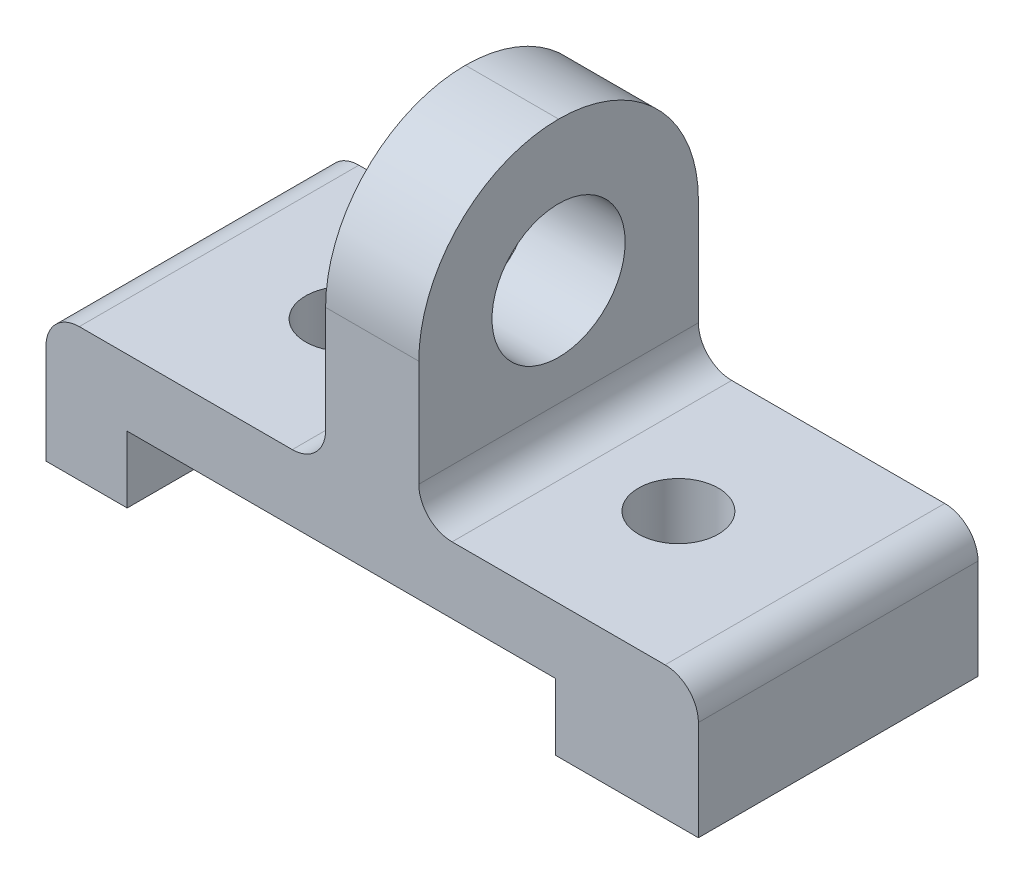
ISO-10303-21;
HEADER;
FILE_DESCRIPTION(('STEP AP214'),'2;1');
FILE_NAME('part.step','',(''),(''),'','','');
FILE_SCHEMA(('AUTOMOTIVE_DESIGN { 1 0 10303 214 1 1 1 1 }'));
ENDSEC;
DATA;
#1=APPLICATION_CONTEXT('core data for automotive mechanical design processes');
#2=APPLICATION_PROTOCOL_DEFINITION('international standard','automotive_design',2000,#1);
#3=PRODUCT_CONTEXT('',#1,'mechanical');
#4=PRODUCT('Part','Part','',(#3));
#5=PRODUCT_RELATED_PRODUCT_CATEGORY('part','',(#4));
#6=PRODUCT_DEFINITION_FORMATION('','',#4);
#7=PRODUCT_DEFINITION_CONTEXT('part definition',#1,'design');
#8=PRODUCT_DEFINITION('design','',#6,#7);
#9=PRODUCT_DEFINITION_SHAPE('','',#8);
#10=(LENGTH_UNIT() NAMED_UNIT(*) SI_UNIT(.MILLI.,.METRE.));
#11=(NAMED_UNIT(*) PLANE_ANGLE_UNIT() SI_UNIT($,.RADIAN.));
#12=(NAMED_UNIT(*) SI_UNIT($,.STERADIAN.) SOLID_ANGLE_UNIT());
#13=UNCERTAINTY_MEASURE_WITH_UNIT(LENGTH_MEASURE(1.E-05),#10,'distance_accuracy_value','');
#14=(GEOMETRIC_REPRESENTATION_CONTEXT(3) GLOBAL_UNCERTAINTY_ASSIGNED_CONTEXT((#13)) GLOBAL_UNIT_ASSIGNED_CONTEXT((#10,
#11,#12)) REPRESENTATION_CONTEXT('',''));
#15=CARTESIAN_POINT('',(0.,0.,0.));
#16=DIRECTION('',(0.,0.,1.));
#17=DIRECTION('',(1.,0.,0.));
#18=AXIS2_PLACEMENT_3D('',#15,#16,#17);
#19=CARTESIAN_POINT('',(76.5282170693056,-10.,-42.));
#20=DIRECTION('',(1.,0.,0.));
#21=DIRECTION('',(0.,0.,-1.));
#22=AXIS2_PLACEMENT_3D('',#19,#20,#21);
#23=PLANE('',#22);
#24=DIRECTION('',(0.,1.,0.));
#25=VECTOR('',#24,1.);
#26=CARTESIAN_POINT('',(76.5282170693056,-10.,-26.4413342527795));
#27=LINE('',#26,#25);
#28=CARTESIAN_POINT('',(76.5282170693056,0.,-26.4413342527795));
#29=VERTEX_POINT('',#28);
#30=CARTESIAN_POINT('',(76.5282170693056,-10.,-26.4413342527795));
#31=VERTEX_POINT('',#30);
#32=EDGE_CURVE('E162',#29,#31,#27,.F.);
#33=ORIENTED_EDGE('',*,*,#32,.F.);
#34=DIRECTION('',(0.,0.,1.));
#35=VECTOR('',#34,1.);
#36=CARTESIAN_POINT('',(76.5282170693056,0.,-42.));
#37=LINE('',#36,#35);
#38=CARTESIAN_POINT('',(76.5282170693056,0.,-42.));
#39=VERTEX_POINT('',#38);
#40=EDGE_CURVE('E191',#39,#29,#37,.T.);
#41=ORIENTED_EDGE('',*,*,#40,.F.);
#42=DIRECTION('',(0.,1.,0.));
#43=VECTOR('',#42,1.);
#44=CARTESIAN_POINT('',(76.5282170693056,-10.,-42.));
#45=LINE('',#44,#43);
#46=CARTESIAN_POINT('',(76.5282170693056,-10.,-42.));
#47=VERTEX_POINT('',#46);
#48=EDGE_CURVE('E188',#47,#39,#45,.T.);
#49=ORIENTED_EDGE('',*,*,#48,.F.);
#50=DIRECTION('',(0.,0.,1.));
#51=VECTOR('',#50,1.);
#52=CARTESIAN_POINT('',(76.5282170693056,-10.,-42.));
#53=LINE('',#52,#51);
#54=EDGE_CURVE('E181',#47,#31,#53,.T.);
#55=ORIENTED_EDGE('',*,*,#54,.T.);
#56=EDGE_LOOP('',(#33,#41,#49,#55));
#57=FACE_BOUND('',#56,.T.);
#58=ADVANCED_FACE('F33',(#57),#23,.F.);
#59=DIRECTION('',(0.,1.,0.));
#60=VECTOR('',#59,1.);
#61=CARTESIAN_POINT('',(76.5282170693056,-10.,-15.5586657472205));
#62=LINE('',#61,#60);
#63=CARTESIAN_POINT('',(76.5282170693056,-10.,-15.5586657472205));
#64=VERTEX_POINT('',#63);
#65=CARTESIAN_POINT('',(76.5282170693056,0.,-15.5586657472205));
#66=VERTEX_POINT('',#65);
#67=EDGE_CURVE('E174',#64,#66,#62,.T.);
#68=ORIENTED_EDGE('',*,*,#67,.F.);
#69=CARTESIAN_POINT('',(76.5282170693056,-10.,0.));
#70=VERTEX_POINT('',#69);
#71=EDGE_CURVE('E184',#64,#70,#53,.T.);
#72=ORIENTED_EDGE('',*,*,#71,.T.);
#73=DIRECTION('',(0.,1.,0.));
#74=VECTOR('',#73,1.);
#75=CARTESIAN_POINT('',(76.5282170693056,-10.,0.));
#76=LINE('',#75,#74);
#77=CARTESIAN_POINT('',(76.5282170693056,0.,0.));
#78=VERTEX_POINT('',#77);
#79=EDGE_CURVE('E317',#70,#78,#76,.T.);
#80=ORIENTED_EDGE('',*,*,#79,.T.);
#81=EDGE_CURVE('E189',#66,#78,#37,.T.);
#82=ORIENTED_EDGE('',*,*,#81,.F.);
#83=EDGE_LOOP('',(#68,#72,#80,#82));
#84=FACE_BOUND('',#83,.T.);
#85=ADVANCED_FACE('F345',(#84),#23,.F.);
#86=CARTESIAN_POINT('',(0.,10.,0.));
#87=DIRECTION('',(0.,-1.,0.));
#88=DIRECTION('',(0.,0.,-1.));
#89=AXIS2_PLACEMENT_3D('',#86,#87,#88);
#90=PLANE('',#89);
#91=CARTESIAN_POINT('',(74.,10.,-21.));
#92=DIRECTION('',(0.,-1.,0.));
#93=DIRECTION('',(0.,0.,1.));
#94=AXIS2_PLACEMENT_3D('',#91,#92,#93);
#95=CIRCLE('',#94,6.);
#96=CARTESIAN_POINT('',(74.,10.,-15.));
#97=VERTEX_POINT('',#96);
#98=EDGE_CURVE('E185',#97,#97,#95,.T.);
#99=ORIENTED_EDGE('',*,*,#98,.T.);
#100=EDGE_LOOP('',(#99));
#101=FACE_BOUND('',#100,.T.);
#102=DIRECTION('',(-1.,0.,0.));
#103=VECTOR('',#102,1.);
#104=CARTESIAN_POINT('',(0.,10.,-42.));
#105=LINE('',#104,#103);
#106=CARTESIAN_POINT('',(93.,10.,-42.));
#107=VERTEX_POINT('',#106);
#108=CARTESIAN_POINT('',(61.,10.,-42.));
#109=VERTEX_POINT('',#108);
#110=EDGE_CURVE('E201',#107,#109,#105,.T.);
#111=ORIENTED_EDGE('',*,*,#110,.T.);
#112=DIRECTION('',(0.,0.,-1.));
#113=VECTOR('',#112,1.);
#114=CARTESIAN_POINT('',(61.,10.,0.));
#115=LINE('',#114,#113);
#116=CARTESIAN_POINT('',(61.,10.,0.));
#117=VERTEX_POINT('',#116);
#118=EDGE_CURVE('E54',#109,#117,#115,.F.);
#119=ORIENTED_EDGE('',*,*,#118,.T.);
#120=DIRECTION('',(1.,0.,0.));
#121=VECTOR('',#120,1.);
#122=CARTESIAN_POINT('',(0.,10.,0.));
#123=LINE('',#122,#121);
#124=CARTESIAN_POINT('',(93.,10.,0.));
#125=VERTEX_POINT('',#124);
#126=EDGE_CURVE('E200',#117,#125,#123,.T.);
#127=ORIENTED_EDGE('',*,*,#126,.T.);
#128=DIRECTION('',(0.,0.,-1.));
#129=VECTOR('',#128,1.);
#130=CARTESIAN_POINT('',(93.,10.,0.));
#131=LINE('',#130,#129);
#132=EDGE_CURVE('E173',#125,#107,#131,.T.);
#133=ORIENTED_EDGE('',*,*,#132,.T.);
#134=EDGE_LOOP('',(#111,#119,#127,#133));
#135=FACE_BOUND('',#134,.T.);
#136=ADVANCED_FACE('F375',(#101,#135),#90,.F.);
#137=CARTESIAN_POINT('',(0.,10.,0.));
#138=DIRECTION('',(0.,0.,-1.));
#139=DIRECTION('',(-1.,0.,0.));
#140=AXIS2_PLACEMENT_3D('',#137,#138,#139);
#141=PLANE('',#140);
#142=CARTESIAN_POINT('',(5.,10.,0.));
#143=VERTEX_POINT('',#142);
#144=CARTESIAN_POINT('',(37.,10.,0.));
#145=VERTEX_POINT('',#144);
#146=EDGE_CURVE('E196',#143,#145,#123,.T.);
#147=ORIENTED_EDGE('',*,*,#146,.F.);
#148=CARTESIAN_POINT('',(5.,5.,0.));
#149=DIRECTION('',(0.,0.,-1.));
#150=DIRECTION('',(-1.,0.,0.));
#151=AXIS2_PLACEMENT_3D('',#148,#149,#150);
#152=CIRCLE('',#151,5.);
#153=CARTESIAN_POINT('',(0.,5.,0.));
#154=VERTEX_POINT('',#153);
#155=EDGE_CURVE('E263',#143,#154,#152,.F.);
#156=ORIENTED_EDGE('',*,*,#155,.T.);
#157=DIRECTION('',(0.,-1.,0.));
#158=VECTOR('',#157,1.);
#159=CARTESIAN_POINT('',(0.,10.,0.));
#160=LINE('',#159,#158);
#161=CARTESIAN_POINT('',(0.,-10.,0.));
#162=VERTEX_POINT('',#161);
#163=EDGE_CURVE('E223',#154,#162,#160,.T.);
#164=ORIENTED_EDGE('',*,*,#163,.T.);
#165=DIRECTION('',(1.,0.,0.));
#166=VECTOR('',#165,1.);
#167=CARTESIAN_POINT('',(0.,-10.,0.));
#168=LINE('',#167,#166);
#169=CARTESIAN_POINT('',(12.1991203389282,-10.,0.));
#170=VERTEX_POINT('',#169);
#171=EDGE_CURVE('E209',#162,#170,#168,.T.);
#172=ORIENTED_EDGE('',*,*,#171,.T.);
#173=DIRECTION('',(0.,1.,0.));
#174=VECTOR('',#173,1.);
#175=CARTESIAN_POINT('',(12.1991203389282,-10.,0.));
#176=LINE('',#175,#174);
#177=CARTESIAN_POINT('',(12.1991203389282,0.,0.));
#178=VERTEX_POINT('',#177);
#179=EDGE_CURVE('E314',#170,#178,#176,.T.);
#180=ORIENTED_EDGE('',*,*,#179,.T.);
#181=DIRECTION('',(1.,0.,0.));
#182=VECTOR('',#181,1.);
#183=CARTESIAN_POINT('',(12.1991203389282,0.,0.));
#184=LINE('',#183,#182);
#185=EDGE_CURVE('E320',#178,#78,#184,.T.);
#186=ORIENTED_EDGE('',*,*,#185,.T.);
#187=ORIENTED_EDGE('',*,*,#79,.F.);
#188=CARTESIAN_POINT('',(98.,-10.,0.));
#189=VERTEX_POINT('',#188);
#190=EDGE_CURVE('E207',#70,#189,#168,.T.);
#191=ORIENTED_EDGE('',*,*,#190,.T.);
#192=DIRECTION('',(0.,-1.,0.));
#193=VECTOR('',#192,1.);
#194=CARTESIAN_POINT('',(98.,10.,0.));
#195=LINE('',#194,#193);
#196=CARTESIAN_POINT('',(98.,5.,0.));
#197=VERTEX_POINT('',#196);
#198=EDGE_CURVE('E221',#197,#189,#195,.T.);
#199=ORIENTED_EDGE('',*,*,#198,.F.);
#200=CARTESIAN_POINT('',(93.,5.,0.));
#201=DIRECTION('',(0.,0.,-1.));
#202=DIRECTION('',(-1.,0.,0.));
#203=AXIS2_PLACEMENT_3D('',#200,#201,#202);
#204=CIRCLE('',#203,5.);
#205=EDGE_CURVE('E257',#197,#125,#204,.F.);
#206=ORIENTED_EDGE('',*,*,#205,.T.);
#207=ORIENTED_EDGE('',*,*,#126,.F.);
#208=CARTESIAN_POINT('',(61.,15.,0.));
#209=DIRECTION('',(0.,0.,-1.));
#210=DIRECTION('',(-1.,0.,0.));
#211=AXIS2_PLACEMENT_3D('',#208,#209,#210);
#212=CIRCLE('',#211,5.);
#213=CARTESIAN_POINT('',(56.,15.,0.));
#214=VERTEX_POINT('',#213);
#215=EDGE_CURVE('E11',#117,#214,#212,.T.);
#216=ORIENTED_EDGE('',*,*,#215,.T.);
#217=DIRECTION('',(0.,-1.,0.));
#218=VECTOR('',#217,1.);
#219=CARTESIAN_POINT('',(56.,10.,0.));
#220=LINE('',#219,#218);
#221=CARTESIAN_POINT('',(56.,31.,0.));
#222=VERTEX_POINT('',#221);
#223=EDGE_CURVE('E304',#222,#214,#220,.T.);
#224=ORIENTED_EDGE('',*,*,#223,.F.);
#225=DIRECTION('',(-1.,0.,0.));
#226=VECTOR('',#225,1.);
#227=CARTESIAN_POINT('',(0.,31.,0.));
#228=LINE('',#227,#226);
#229=CARTESIAN_POINT('',(42.,31.,0.));
#230=VERTEX_POINT('',#229);
#231=EDGE_CURVE('E225',#222,#230,#228,.T.);
#232=ORIENTED_EDGE('',*,*,#231,.T.);
#233=DIRECTION('',(0.,-1.,0.));
#234=VECTOR('',#233,1.);
#235=CARTESIAN_POINT('',(42.,10.,0.));
#236=LINE('',#235,#234);
#237=CARTESIAN_POINT('',(42.,15.,0.));
#238=VERTEX_POINT('',#237);
#239=EDGE_CURVE('E243',#230,#238,#236,.T.);
#240=ORIENTED_EDGE('',*,*,#239,.T.);
#241=CARTESIAN_POINT('',(37.,15.,0.));
#242=DIRECTION('',(0.,0.,-1.));
#243=DIRECTION('',(-1.,0.,0.));
#244=AXIS2_PLACEMENT_3D('',#241,#242,#243);
#245=CIRCLE('',#244,5.);
#246=EDGE_CURVE('E281',#238,#145,#245,.T.);
#247=ORIENTED_EDGE('',*,*,#246,.T.);
#248=EDGE_LOOP('',(#147,#156,#164,#172,#180,#186,#187,#191,#199,#206,#207,#216,#224,#232,#240,#247));
#249=FACE_BOUND('',#248,.T.);
#250=ADVANCED_FACE('F286',(#249),#141,.F.);
#251=CARTESIAN_POINT('',(0.,10.,-42.));
#252=DIRECTION('',(0.,0.,1.));
#253=DIRECTION('',(1.,0.,0.));
#254=AXIS2_PLACEMENT_3D('',#251,#252,#253);
#255=PLANE('',#254);
#256=DIRECTION('',(0.,-1.,0.));
#257=VECTOR('',#256,1.);
#258=CARTESIAN_POINT('',(0.,10.,-42.));
#259=LINE('',#258,#257);
#260=CARTESIAN_POINT('',(0.,5.,-42.));
#261=VERTEX_POINT('',#260);
#262=CARTESIAN_POINT('',(0.,-10.,-42.));
#263=VERTEX_POINT('',#262);
#264=EDGE_CURVE('E203',#261,#263,#259,.T.);
#265=ORIENTED_EDGE('',*,*,#264,.F.);
#266=CARTESIAN_POINT('',(5.,5.,-42.));
#267=DIRECTION('',(0.,0.,1.));
#268=DIRECTION('',(1.,0.,0.));
#269=AXIS2_PLACEMENT_3D('',#266,#267,#268);
#270=CIRCLE('',#269,5.);
#271=CARTESIAN_POINT('',(5.,10.,-42.));
#272=VERTEX_POINT('',#271);
#273=EDGE_CURVE('E267',#261,#272,#270,.F.);
#274=ORIENTED_EDGE('',*,*,#273,.T.);
#275=CARTESIAN_POINT('',(37.,10.,-42.));
#276=VERTEX_POINT('',#275);
#277=EDGE_CURVE('E199',#276,#272,#105,.T.);
#278=ORIENTED_EDGE('',*,*,#277,.F.);
#279=CARTESIAN_POINT('',(37.,15.,-42.));
#280=DIRECTION('',(0.,0.,1.));
#281=DIRECTION('',(1.,0.,0.));
#282=AXIS2_PLACEMENT_3D('',#279,#280,#281);
#283=CIRCLE('',#282,5.);
#284=CARTESIAN_POINT('',(42.,15.,-42.));
#285=VERTEX_POINT('',#284);
#286=EDGE_CURVE('E279',#276,#285,#283,.T.);
#287=ORIENTED_EDGE('',*,*,#286,.T.);
#288=DIRECTION('',(0.,1.,0.));
#289=VECTOR('',#288,1.);
#290=CARTESIAN_POINT('',(42.,10.,-42.));
#291=LINE('',#290,#289);
#292=CARTESIAN_POINT('',(42.,31.,-42.));
#293=VERTEX_POINT('',#292);
#294=EDGE_CURVE('E299',#285,#293,#291,.T.);
#295=ORIENTED_EDGE('',*,*,#294,.T.);
#296=DIRECTION('',(-1.,0.,0.));
#297=VECTOR('',#296,1.);
#298=CARTESIAN_POINT('',(0.,31.,-42.));
#299=LINE('',#298,#297);
#300=CARTESIAN_POINT('',(56.,31.,-42.));
#301=VERTEX_POINT('',#300);
#302=EDGE_CURVE('E237',#293,#301,#299,.F.);
#303=ORIENTED_EDGE('',*,*,#302,.T.);
#304=DIRECTION('',(0.,1.,0.));
#305=VECTOR('',#304,1.);
#306=CARTESIAN_POINT('',(56.,10.,-42.));
#307=LINE('',#306,#305);
#308=CARTESIAN_POINT('',(56.,15.,-42.));
#309=VERTEX_POINT('',#308);
#310=EDGE_CURVE('E307',#309,#301,#307,.T.);
#311=ORIENTED_EDGE('',*,*,#310,.F.);
#312=CARTESIAN_POINT('',(61.,15.,-42.));
#313=DIRECTION('',(0.,0.,1.));
#314=DIRECTION('',(1.,0.,0.));
#315=AXIS2_PLACEMENT_3D('',#312,#313,#314);
#316=CIRCLE('',#315,5.);
#317=EDGE_CURVE('E41',#309,#109,#316,.T.);
#318=ORIENTED_EDGE('',*,*,#317,.T.);
#319=ORIENTED_EDGE('',*,*,#110,.F.);
#320=CARTESIAN_POINT('',(93.,5.,-42.));
#321=DIRECTION('',(0.,0.,1.));
#322=DIRECTION('',(1.,0.,0.));
#323=AXIS2_PLACEMENT_3D('',#320,#321,#322);
#324=CIRCLE('',#323,5.);
#325=CARTESIAN_POINT('',(98.,5.,-42.));
#326=VERTEX_POINT('',#325);
#327=EDGE_CURVE('E253',#107,#326,#324,.F.);
#328=ORIENTED_EDGE('',*,*,#327,.T.);
#329=DIRECTION('',(0.,-1.,0.));
#330=VECTOR('',#329,1.);
#331=CARTESIAN_POINT('',(98.,10.,-42.));
#332=LINE('',#331,#330);
#333=CARTESIAN_POINT('',(98.,-10.,-42.));
#334=VERTEX_POINT('',#333);
#335=EDGE_CURVE('E219',#326,#334,#332,.T.);
#336=ORIENTED_EDGE('',*,*,#335,.T.);
#337=DIRECTION('',(-1.,0.,0.));
#338=VECTOR('',#337,1.);
#339=CARTESIAN_POINT('',(0.,-10.,-42.));
#340=LINE('',#339,#338);
#341=EDGE_CURVE('E216',#334,#47,#340,.T.);
#342=ORIENTED_EDGE('',*,*,#341,.T.);
#343=ORIENTED_EDGE('',*,*,#48,.T.);
#344=DIRECTION('',(1.,0.,0.));
#345=VECTOR('',#344,1.);
#346=CARTESIAN_POINT('',(12.1991203389282,0.,-42.));
#347=LINE('',#346,#345);
#348=CARTESIAN_POINT('',(12.1991203389282,0.,-42.));
#349=VERTEX_POINT('',#348);
#350=EDGE_CURVE('E313',#349,#39,#347,.T.);
#351=ORIENTED_EDGE('',*,*,#350,.F.);
#352=DIRECTION('',(0.,1.,0.));
#353=VECTOR('',#352,1.);
#354=CARTESIAN_POINT('',(12.1991203389282,-10.,-42.));
#355=LINE('',#354,#353);
#356=CARTESIAN_POINT('',(12.1991203389282,-10.,-42.));
#357=VERTEX_POINT('',#356);
#358=EDGE_CURVE('E193',#357,#349,#355,.T.);
#359=ORIENTED_EDGE('',*,*,#358,.F.);
#360=EDGE_CURVE('E215',#357,#263,#340,.T.);
#361=ORIENTED_EDGE('',*,*,#360,.T.);
#362=EDGE_LOOP('',(#265,#274,#278,#287,#295,#303,#311,#318,#319,#328,#336,#342,#343,#351,#359,#361));
#363=FACE_BOUND('',#362,.T.);
#364=ADVANCED_FACE('F298',(#363),#255,.F.);
#365=CARTESIAN_POINT('',(0.,-10.,0.));
#366=DIRECTION('',(0.,-1.,0.));
#367=DIRECTION('',(0.,0.,-1.));
#368=AXIS2_PLACEMENT_3D('',#365,#366,#367);
#369=PLANE('',#368);
#370=ORIENTED_EDGE('',*,*,#360,.F.);
#371=DIRECTION('',(0.,0.,1.));
#372=VECTOR('',#371,1.);
#373=CARTESIAN_POINT('',(12.1991203389282,-10.,-42.));
#374=LINE('',#373,#372);
#375=EDGE_CURVE('E208',#357,#170,#374,.T.);
#376=ORIENTED_EDGE('',*,*,#375,.T.);
#377=ORIENTED_EDGE('',*,*,#171,.F.);
#378=DIRECTION('',(0.,0.,1.));
#379=VECTOR('',#378,1.);
#380=CARTESIAN_POINT('',(0.,-10.,0.));
#381=LINE('',#380,#379);
#382=EDGE_CURVE('E204',#263,#162,#381,.T.);
#383=ORIENTED_EDGE('',*,*,#382,.F.);
#384=EDGE_LOOP('',(#370,#376,#377,#383));
#385=FACE_BOUND('',#384,.T.);
#386=ADVANCED_FACE('F350',(#385),#369,.T.);
#387=CARTESIAN_POINT('',(0.,10.,0.));
#388=DIRECTION('',(1.,0.,0.));
#389=DIRECTION('',(0.,0.,-1.));
#390=AXIS2_PLACEMENT_3D('',#387,#388,#389);
#391=PLANE('',#390);
#392=ORIENTED_EDGE('',*,*,#163,.F.);
#393=DIRECTION('',(0.,0.,1.));
#394=VECTOR('',#393,1.);
#395=CARTESIAN_POINT('',(0.,5.,0.));
#396=LINE('',#395,#394);
#397=EDGE_CURVE('E265',#154,#261,#396,.F.);
#398=ORIENTED_EDGE('',*,*,#397,.T.);
#399=ORIENTED_EDGE('',*,*,#264,.T.);
#400=ORIENTED_EDGE('',*,*,#382,.T.);
#401=EDGE_LOOP('',(#392,#398,#399,#400));
#402=FACE_BOUND('',#401,.T.);
#403=ADVANCED_FACE('F359',(#402),#391,.F.);
#404=CARTESIAN_POINT('',(98.,10.,0.));
#405=DIRECTION('',(-1.,0.,0.));
#406=DIRECTION('',(0.,0.,1.));
#407=AXIS2_PLACEMENT_3D('',#404,#405,#406);
#408=PLANE('',#407);
#409=ORIENTED_EDGE('',*,*,#335,.F.);
#410=DIRECTION('',(0.,0.,-1.));
#411=VECTOR('',#410,1.);
#412=CARTESIAN_POINT('',(98.,5.,0.));
#413=LINE('',#412,#411);
#414=EDGE_CURVE('E255',#326,#197,#413,.F.);
#415=ORIENTED_EDGE('',*,*,#414,.T.);
#416=ORIENTED_EDGE('',*,*,#198,.T.);
#417=DIRECTION('',(0.,0.,-1.));
#418=VECTOR('',#417,1.);
#419=CARTESIAN_POINT('',(98.,-10.,0.));
#420=LINE('',#419,#418);
#421=EDGE_CURVE('E212',#189,#334,#420,.T.);
#422=ORIENTED_EDGE('',*,*,#421,.T.);
#423=EDGE_LOOP('',(#409,#415,#416,#422));
#424=FACE_BOUND('',#423,.T.);
#425=ADVANCED_FACE('F339',(#424),#408,.F.);
#426=CARTESIAN_POINT('',(24.,10.,-21.));
#427=DIRECTION('',(0.,1.,0.));
#428=DIRECTION('',(0.,0.,1.));
#429=AXIS2_PLACEMENT_3D('',#426,#427,#428);
#430=CIRCLE('',#429,6.);
#431=CARTESIAN_POINT('',(24.,10.,-15.));
#432=VERTEX_POINT('',#431);
#433=EDGE_CURVE('E249',#432,#432,#430,.T.);
#434=ORIENTED_EDGE('',*,*,#433,.F.);
#435=EDGE_LOOP('',(#434));
#436=FACE_BOUND('',#435,.T.);
#437=ORIENTED_EDGE('',*,*,#146,.T.);
#438=DIRECTION('',(0.,0.,-1.));
#439=VECTOR('',#438,1.);
#440=CARTESIAN_POINT('',(37.,10.,0.));
#441=LINE('',#440,#439);
#442=EDGE_CURVE('E270',#145,#276,#441,.T.);
#443=ORIENTED_EDGE('',*,*,#442,.T.);
#444=ORIENTED_EDGE('',*,*,#277,.T.);
#445=DIRECTION('',(0.,0.,1.));
#446=VECTOR('',#445,1.);
#447=CARTESIAN_POINT('',(5.,10.,0.));
#448=LINE('',#447,#446);
#449=EDGE_CURVE('E260',#272,#143,#448,.T.);
#450=ORIENTED_EDGE('',*,*,#449,.T.);
#451=EDGE_LOOP('',(#437,#443,#444,#450));
#452=FACE_BOUND('',#451,.T.);
#453=ADVANCED_FACE('F292',(#436,#452),#90,.F.);
#454=ORIENTED_EDGE('',*,*,#71,.F.);
#455=CARTESIAN_POINT('',(74.,-10.,-21.));
#456=DIRECTION('',(0.,-1.,0.));
#457=DIRECTION('',(0.,0.,1.));
#458=AXIS2_PLACEMENT_3D('',#455,#456,#457);
#459=CIRCLE('',#458,6.);
#460=EDGE_CURVE('E165',#31,#64,#459,.T.);
#461=ORIENTED_EDGE('',*,*,#460,.F.);
#462=ORIENTED_EDGE('',*,*,#54,.F.);
#463=ORIENTED_EDGE('',*,*,#341,.F.);
#464=ORIENTED_EDGE('',*,*,#421,.F.);
#465=ORIENTED_EDGE('',*,*,#190,.F.);
#466=EDGE_LOOP('',(#454,#461,#462,#463,#464,#465));
#467=FACE_BOUND('',#466,.T.);
#468=ADVANCED_FACE('F179',(#467),#369,.T.);
#469=CARTESIAN_POINT('',(12.1991203389282,-10.,-42.));
#470=DIRECTION('',(1.,0.,0.));
#471=DIRECTION('',(0.,0.,-1.));
#472=AXIS2_PLACEMENT_3D('',#469,#470,#471);
#473=PLANE('',#472);
#474=ORIENTED_EDGE('',*,*,#179,.F.);
#475=ORIENTED_EDGE('',*,*,#375,.F.);
#476=ORIENTED_EDGE('',*,*,#358,.T.);
#477=DIRECTION('',(0.,0.,1.));
#478=VECTOR('',#477,1.);
#479=CARTESIAN_POINT('',(12.1991203389282,0.,-42.));
#480=LINE('',#479,#478);
#481=EDGE_CURVE('E326',#349,#178,#480,.T.);
#482=ORIENTED_EDGE('',*,*,#481,.T.);
#483=EDGE_LOOP('',(#474,#475,#476,#482));
#484=FACE_BOUND('',#483,.T.);
#485=ADVANCED_FACE('F347',(#484),#473,.T.);
#486=CARTESIAN_POINT('',(12.1991203389282,0.,-42.));
#487=DIRECTION('',(0.,-1.,0.));
#488=DIRECTION('',(0.,0.,-1.));
#489=AXIS2_PLACEMENT_3D('',#486,#487,#488);
#490=PLANE('',#489);
#491=CARTESIAN_POINT('',(24.,0.,-21.));
#492=DIRECTION('',(0.,-1.,0.));
#493=DIRECTION('',(0.,0.,-1.));
#494=AXIS2_PLACEMENT_3D('',#491,#492,#493);
#495=CIRCLE('',#494,6.);
#496=CARTESIAN_POINT('',(24.,0.,-27.));
#497=VERTEX_POINT('',#496);
#498=EDGE_CURVE('E245',#497,#497,#495,.T.);
#499=ORIENTED_EDGE('',*,*,#498,.F.);
#500=EDGE_LOOP('',(#499));
#501=FACE_BOUND('',#500,.T.);
#502=ORIENTED_EDGE('',*,*,#40,.T.);
#503=CARTESIAN_POINT('',(74.,0.,-21.));
#504=DIRECTION('',(0.,-1.,0.));
#505=DIRECTION('',(0.,0.,-1.));
#506=AXIS2_PLACEMENT_3D('',#503,#504,#505);
#507=CIRCLE('',#506,6.);
#508=EDGE_CURVE('E168',#29,#66,#507,.F.);
#509=ORIENTED_EDGE('',*,*,#508,.T.);
#510=ORIENTED_EDGE('',*,*,#81,.T.);
#511=ORIENTED_EDGE('',*,*,#185,.F.);
#512=ORIENTED_EDGE('',*,*,#481,.F.);
#513=ORIENTED_EDGE('',*,*,#350,.T.);
#514=EDGE_LOOP('',(#502,#509,#510,#511,#512,#513));
#515=FACE_BOUND('',#514,.T.);
#516=ADVANCED_FACE('F331',(#501,#515),#490,.T.);
#517=CARTESIAN_POINT('',(56.,0.,0.));
#518=DIRECTION('',(-1.,0.,0.));
#519=DIRECTION('',(0.,0.,1.));
#520=AXIS2_PLACEMENT_3D('',#517,#518,#519);
#521=PLANE('',#520);
#522=CARTESIAN_POINT('',(56.,31.,-21.));
#523=DIRECTION('',(1.,0.,0.));
#524=DIRECTION('',(0.,0.,-1.));
#525=AXIS2_PLACEMENT_3D('',#522,#523,#524);
#526=CIRCLE('',#525,10.);
#527=CARTESIAN_POINT('',(56.,31.,-31.));
#528=VERTEX_POINT('',#527);
#529=EDGE_CURVE('E248',#528,#528,#526,.T.);
#530=ORIENTED_EDGE('',*,*,#529,.F.);
#531=EDGE_LOOP('',(#530));
#532=FACE_BOUND('',#531,.T.);
#533=ORIENTED_EDGE('',*,*,#223,.T.);
#534=DIRECTION('',(0.,0.,-1.));
#535=VECTOR('',#534,1.);
#536=CARTESIAN_POINT('',(56.,15.,-42.));
#537=LINE('',#536,#535);
#538=EDGE_CURVE('E275',#214,#309,#537,.T.);
#539=ORIENTED_EDGE('',*,*,#538,.T.);
#540=ORIENTED_EDGE('',*,*,#310,.T.);
#541=CARTESIAN_POINT('',(56.,31.,-21.));
#542=DIRECTION('',(-1.,0.,0.));
#543=DIRECTION('',(0.,0.,1.));
#544=AXIS2_PLACEMENT_3D('',#541,#542,#543);
#545=CIRCLE('',#544,21.);
#546=CARTESIAN_POINT('',(56.,52.,-21.));
#547=VERTEX_POINT('',#546);
#548=EDGE_CURVE('E233',#301,#547,#545,.F.);
#549=ORIENTED_EDGE('',*,*,#548,.T.);
#550=CARTESIAN_POINT('',(56.,31.,-21.));
#551=DIRECTION('',(-1.,0.,0.));
#552=DIRECTION('',(0.,0.,1.));
#553=AXIS2_PLACEMENT_3D('',#550,#551,#552);
#554=CIRCLE('',#553,21.);
#555=EDGE_CURVE('E235',#547,#222,#554,.F.);
#556=ORIENTED_EDGE('',*,*,#555,.T.);
#557=EDGE_LOOP('',(#533,#539,#540,#549,#556));
#558=FACE_BOUND('',#557,.T.);
#559=ADVANCED_FACE('F400',(#532,#558),#521,.F.);
#560=CARTESIAN_POINT('',(42.,0.,0.));
#561=DIRECTION('',(-1.,0.,0.));
#562=DIRECTION('',(0.,0.,1.));
#563=AXIS2_PLACEMENT_3D('',#560,#561,#562);
#564=PLANE('',#563);
#565=CARTESIAN_POINT('',(42.,31.,-21.));
#566=DIRECTION('',(1.,0.,0.));
#567=DIRECTION('',(0.,0.,-1.));
#568=AXIS2_PLACEMENT_3D('',#565,#566,#567);
#569=CIRCLE('',#568,10.);
#570=CARTESIAN_POINT('',(42.,31.,-31.));
#571=VERTEX_POINT('',#570);
#572=EDGE_CURVE('E244',#571,#571,#569,.T.);
#573=ORIENTED_EDGE('',*,*,#572,.T.);
#574=EDGE_LOOP('',(#573));
#575=FACE_BOUND('',#574,.T.);
#576=ORIENTED_EDGE('',*,*,#294,.F.);
#577=DIRECTION('',(0.,0.,-1.));
#578=VECTOR('',#577,1.);
#579=CARTESIAN_POINT('',(42.,15.,0.));
#580=LINE('',#579,#578);
#581=EDGE_CURVE('E273',#285,#238,#580,.F.);
#582=ORIENTED_EDGE('',*,*,#581,.T.);
#583=ORIENTED_EDGE('',*,*,#239,.F.);
#584=CARTESIAN_POINT('',(42.,31.,-21.));
#585=DIRECTION('',(-1.,0.,0.));
#586=DIRECTION('',(0.,0.,1.));
#587=AXIS2_PLACEMENT_3D('',#584,#585,#586);
#588=CIRCLE('',#587,21.);
#589=CARTESIAN_POINT('',(42.,52.,-21.));
#590=VERTEX_POINT('',#589);
#591=EDGE_CURVE('E231',#230,#590,#588,.T.);
#592=ORIENTED_EDGE('',*,*,#591,.T.);
#593=CARTESIAN_POINT('',(42.,31.,-21.));
#594=DIRECTION('',(-1.,0.,0.));
#595=DIRECTION('',(0.,0.,1.));
#596=AXIS2_PLACEMENT_3D('',#593,#594,#595);
#597=CIRCLE('',#596,21.);
#598=EDGE_CURVE('E228',#590,#293,#597,.T.);
#599=ORIENTED_EDGE('',*,*,#598,.T.);
#600=EDGE_LOOP('',(#576,#582,#583,#592,#599));
#601=FACE_BOUND('',#600,.T.);
#602=ADVANCED_FACE('F301',(#575,#601),#564,.T.);
#603=CARTESIAN_POINT('',(56.,31.,-21.));
#604=DIRECTION('',(-1.,0.,0.));
#605=DIRECTION('',(0.,0.,1.));
#606=AXIS2_PLACEMENT_3D('',#603,#604,#605);
#607=CYLINDRICAL_SURFACE('',#606,21.);
#608=DIRECTION('',(-1.,0.,0.));
#609=VECTOR('',#608,1.);
#610=CARTESIAN_POINT('',(56.,52.,-21.));
#611=LINE('',#610,#609);
#612=EDGE_CURVE('E240',#547,#590,#611,.T.);
#613=ORIENTED_EDGE('',*,*,#612,.F.);
#614=ORIENTED_EDGE('',*,*,#548,.F.);
#615=ORIENTED_EDGE('',*,*,#302,.F.);
#616=ORIENTED_EDGE('',*,*,#598,.F.);
#617=EDGE_LOOP('',(#613,#614,#615,#616));
#618=FACE_BOUND('',#617,.T.);
#619=ADVANCED_FACE('F407',(#618),#607,.T.);
#620=CARTESIAN_POINT('',(0.,31.,-21.));
#621=DIRECTION('',(-1.,0.,0.));
#622=DIRECTION('',(0.,0.,1.));
#623=AXIS2_PLACEMENT_3D('',#620,#621,#622);
#624=CYLINDRICAL_SURFACE('',#623,21.);
#625=ORIENTED_EDGE('',*,*,#555,.F.);
#626=ORIENTED_EDGE('',*,*,#612,.T.);
#627=ORIENTED_EDGE('',*,*,#591,.F.);
#628=ORIENTED_EDGE('',*,*,#231,.F.);
#629=EDGE_LOOP('',(#625,#626,#627,#628));
#630=FACE_BOUND('',#629,.T.);
#631=ADVANCED_FACE('F405',(#630),#624,.T.);
#632=CARTESIAN_POINT('',(42.,31.,-21.));
#633=DIRECTION('',(1.,0.,0.));
#634=DIRECTION('',(0.,0.,-1.));
#635=AXIS2_PLACEMENT_3D('',#632,#633,#634);
#636=CYLINDRICAL_SURFACE('',#635,10.);
#637=ORIENTED_EDGE('',*,*,#572,.F.);
#638=EDGE_LOOP('',(#637));
#639=FACE_BOUND('',#638,.T.);
#640=ORIENTED_EDGE('',*,*,#529,.T.);
#641=EDGE_LOOP('',(#640));
#642=FACE_BOUND('',#641,.T.);
#643=ADVANCED_FACE('F420',(#639,#642),#636,.F.);
#644=CARTESIAN_POINT('',(24.,-10.,-21.));
#645=DIRECTION('',(0.,1.,0.));
#646=DIRECTION('',(0.,0.,1.));
#647=AXIS2_PLACEMENT_3D('',#644,#645,#646);
#648=CYLINDRICAL_SURFACE('',#647,6.);
#649=ORIENTED_EDGE('',*,*,#498,.T.);
#650=EDGE_LOOP('',(#649));
#651=FACE_BOUND('',#650,.T.);
#652=ORIENTED_EDGE('',*,*,#433,.T.);
#653=EDGE_LOOP('',(#652));
#654=FACE_BOUND('',#653,.T.);
#655=ADVANCED_FACE('F418',(#651,#654),#648,.F.);
#656=CARTESIAN_POINT('',(74.,-10.,-21.));
#657=DIRECTION('',(0.,1.,0.));
#658=DIRECTION('',(0.,0.,1.));
#659=AXIS2_PLACEMENT_3D('',#656,#657,#658);
#660=CYLINDRICAL_SURFACE('',#659,6.);
#661=ORIENTED_EDGE('',*,*,#98,.F.);
#662=EDGE_LOOP('',(#661));
#663=FACE_BOUND('',#662,.T.);
#664=ORIENTED_EDGE('',*,*,#32,.T.);
#665=ORIENTED_EDGE('',*,*,#460,.T.);
#666=ORIENTED_EDGE('',*,*,#67,.T.);
#667=ORIENTED_EDGE('',*,*,#508,.F.);
#668=EDGE_LOOP('',(#664,#665,#666,#667));
#669=FACE_BOUND('',#668,.T.);
#670=ADVANCED_FACE('F164',(#663,#669),#660,.F.);
#671=CARTESIAN_POINT('',(93.,5.,0.));
#672=DIRECTION('',(0.,0.,-1.));
#673=DIRECTION('',(-1.,0.,0.));
#674=AXIS2_PLACEMENT_3D('',#671,#672,#673);
#675=CYLINDRICAL_SURFACE('',#674,5.);
#676=ORIENTED_EDGE('',*,*,#205,.F.);
#677=ORIENTED_EDGE('',*,*,#414,.F.);
#678=ORIENTED_EDGE('',*,*,#327,.F.);
#679=ORIENTED_EDGE('',*,*,#132,.F.);
#680=EDGE_LOOP('',(#676,#677,#678,#679));
#681=FACE_BOUND('',#680,.T.);
#682=ADVANCED_FACE('F427',(#681),#675,.T.);
#683=CARTESIAN_POINT('',(5.,5.,0.));
#684=DIRECTION('',(0.,0.,1.));
#685=DIRECTION('',(1.,0.,0.));
#686=AXIS2_PLACEMENT_3D('',#683,#684,#685);
#687=CYLINDRICAL_SURFACE('',#686,5.);
#688=ORIENTED_EDGE('',*,*,#273,.F.);
#689=ORIENTED_EDGE('',*,*,#397,.F.);
#690=ORIENTED_EDGE('',*,*,#155,.F.);
#691=ORIENTED_EDGE('',*,*,#449,.F.);
#692=EDGE_LOOP('',(#688,#689,#690,#691));
#693=FACE_BOUND('',#692,.T.);
#694=ADVANCED_FACE('F357',(#693),#687,.T.);
#695=CARTESIAN_POINT('',(37.,15.,0.));
#696=DIRECTION('',(0.,0.,-1.));
#697=DIRECTION('',(-1.,0.,0.));
#698=AXIS2_PLACEMENT_3D('',#695,#696,#697);
#699=CYLINDRICAL_SURFACE('',#698,5.);
#700=ORIENTED_EDGE('',*,*,#246,.F.);
#701=ORIENTED_EDGE('',*,*,#581,.F.);
#702=ORIENTED_EDGE('',*,*,#286,.F.);
#703=ORIENTED_EDGE('',*,*,#442,.F.);
#704=EDGE_LOOP('',(#700,#701,#702,#703));
#705=FACE_BOUND('',#704,.T.);
#706=ADVANCED_FACE('F295',(#705),#699,.F.);
#707=CARTESIAN_POINT('',(61.,15.,0.));
#708=DIRECTION('',(0.,0.,1.));
#709=DIRECTION('',(1.,0.,0.));
#710=AXIS2_PLACEMENT_3D('',#707,#708,#709);
#711=CYLINDRICAL_SURFACE('',#710,5.);
#712=ORIENTED_EDGE('',*,*,#215,.F.);
#713=ORIENTED_EDGE('',*,*,#118,.F.);
#714=ORIENTED_EDGE('',*,*,#317,.F.);
#715=ORIENTED_EDGE('',*,*,#538,.F.);
#716=EDGE_LOOP('',(#712,#713,#714,#715));
#717=FACE_BOUND('',#716,.T.);
#718=ADVANCED_FACE('F35',(#717),#711,.F.);
#719=CLOSED_SHELL('',(#58,#85,#136,#250,#364,#386,#403,#425,#453,#468,#485,#516,#559,#602,#619,
#631,#643,#655,#670,#682,#694,#706,#718));
#720=MANIFOLD_SOLID_BREP('B2',#719);
#721=ADVANCED_BREP_SHAPE_REPRESENTATION('',(#18,#720),#14);
#722=SHAPE_DEFINITION_REPRESENTATION(#9,#721);
ENDSEC;
END-ISO-10303-21;
